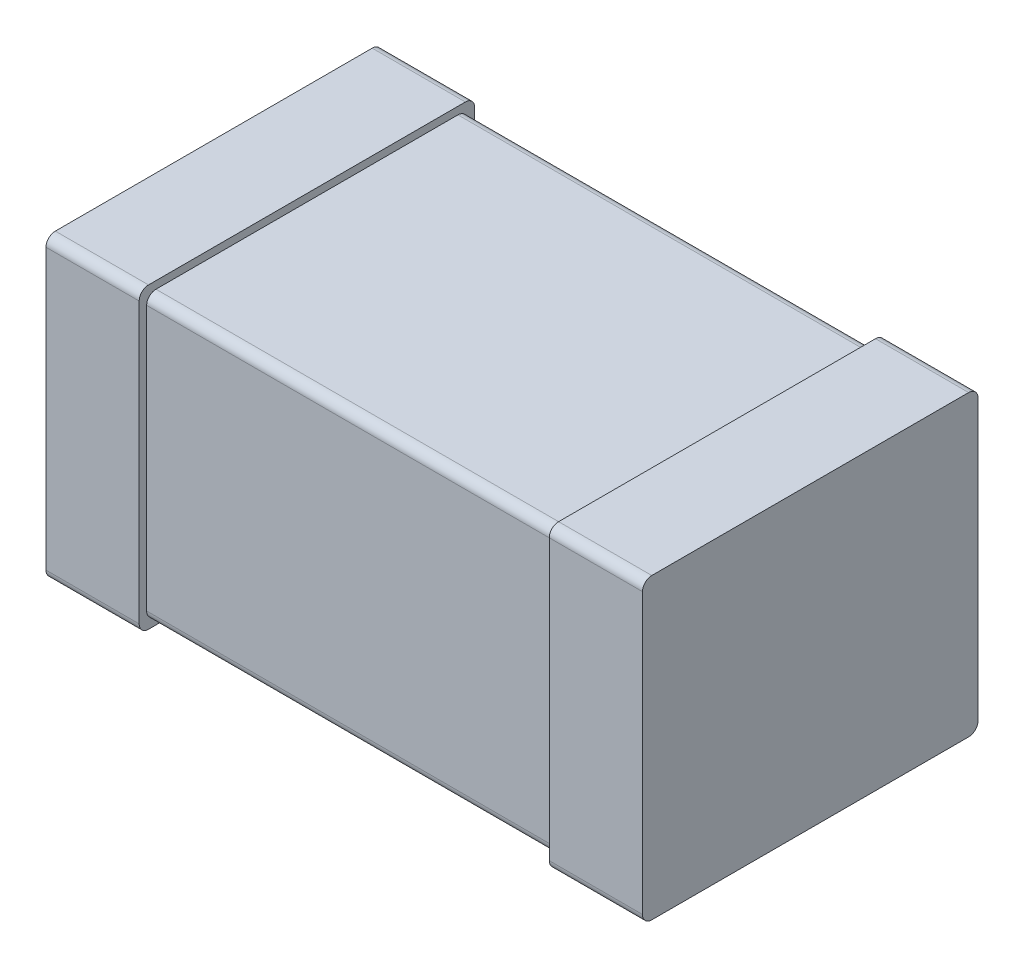
ISO-10303-21;
HEADER;
FILE_DESCRIPTION(('STEP AP214'),'2;1');
FILE_NAME('part.step','',(''),(''),'','','');
FILE_SCHEMA(('AUTOMOTIVE_DESIGN { 1 0 10303 214 1 1 1 1 }'));
ENDSEC;
DATA;
#1=APPLICATION_CONTEXT('core data for automotive mechanical design processes');
#2=APPLICATION_PROTOCOL_DEFINITION('international standard','automotive_design',2000,#1);
#3=PRODUCT_CONTEXT('',#1,'mechanical');
#4=PRODUCT('Part','Part','',(#3));
#5=PRODUCT_RELATED_PRODUCT_CATEGORY('part','',(#4));
#6=PRODUCT_DEFINITION_FORMATION('','',#4);
#7=PRODUCT_DEFINITION_CONTEXT('part definition',#1,'design');
#8=PRODUCT_DEFINITION('design','',#6,#7);
#9=PRODUCT_DEFINITION_SHAPE('','',#8);
#10=(LENGTH_UNIT() NAMED_UNIT(*) SI_UNIT(.MILLI.,.METRE.));
#11=(NAMED_UNIT(*) PLANE_ANGLE_UNIT() SI_UNIT($,.RADIAN.));
#12=(NAMED_UNIT(*) SI_UNIT($,.STERADIAN.) SOLID_ANGLE_UNIT());
#13=UNCERTAINTY_MEASURE_WITH_UNIT(LENGTH_MEASURE(1.E-05),#10,'distance_accuracy_value','');
#14=(GEOMETRIC_REPRESENTATION_CONTEXT(3) GLOBAL_UNCERTAINTY_ASSIGNED_CONTEXT((#13)) GLOBAL_UNIT_ASSIGNED_CONTEXT((#10,
#11,#12)) REPRESENTATION_CONTEXT('',''));
#15=CARTESIAN_POINT('',(0.,0.,0.));
#16=DIRECTION('',(0.,0.,1.));
#17=DIRECTION('',(1.,0.,0.));
#18=AXIS2_PLACEMENT_3D('',#15,#16,#17);
#19=CARTESIAN_POINT('',(0.8,-0.4,0.));
#20=DIRECTION('',(1.,0.,0.));
#21=DIRECTION('',(0.,0.,-1.));
#22=AXIS2_PLACEMENT_3D('',#19,#20,#21);
#23=PLANE('',#22);
#24=DIRECTION('',(0.,1.,0.));
#25=VECTOR('',#24,1.);
#26=CARTESIAN_POINT('',(0.8,-0.4,0.9));
#27=LINE('',#26,#25);
#28=CARTESIAN_POINT('',(0.8,-0.375,0.9));
#29=VERTEX_POINT('',#28);
#30=CARTESIAN_POINT('',(0.8,0.375,0.9));
#31=VERTEX_POINT('',#30);
#32=EDGE_CURVE('E294',#29,#31,#27,.T.);
#33=ORIENTED_EDGE('',*,*,#32,.F.);
#34=CARTESIAN_POINT('',(0.8,-0.375,0.875));
#35=DIRECTION('',(1.,0.,0.));
#36=DIRECTION('',(0.,0.,-1.));
#37=AXIS2_PLACEMENT_3D('',#34,#35,#36);
#38=CIRCLE('',#37,0.025);
#39=CARTESIAN_POINT('',(0.8,-0.4,0.875));
#40=VERTEX_POINT('',#39);
#41=EDGE_CURVE('E178',#40,#29,#38,.F.);
#42=ORIENTED_EDGE('',*,*,#41,.F.);
#43=DIRECTION('',(0.,0.,1.));
#44=VECTOR('',#43,1.);
#45=CARTESIAN_POINT('',(0.8,-0.4,0.));
#46=LINE('',#45,#44);
#47=CARTESIAN_POINT('',(0.8,-0.4,0.025));
#48=VERTEX_POINT('',#47);
#49=EDGE_CURVE('E175',#40,#48,#46,.F.);
#50=ORIENTED_EDGE('',*,*,#49,.T.);
#51=CARTESIAN_POINT('',(0.8,-0.375,0.025));
#52=DIRECTION('',(1.,0.,0.));
#53=DIRECTION('',(0.,0.,-1.));
#54=AXIS2_PLACEMENT_3D('',#51,#52,#53);
#55=CIRCLE('',#54,0.025);
#56=CARTESIAN_POINT('',(0.8,-0.375,0.));
#57=VERTEX_POINT('',#56);
#58=EDGE_CURVE('E20',#57,#48,#55,.F.);
#59=ORIENTED_EDGE('',*,*,#58,.F.);
#60=DIRECTION('',(0.,1.,0.));
#61=VECTOR('',#60,1.);
#62=CARTESIAN_POINT('',(0.8,-0.4,0.));
#63=LINE('',#62,#61);
#64=CARTESIAN_POINT('',(0.8,0.375,0.));
#65=VERTEX_POINT('',#64);
#66=EDGE_CURVE('E197',#57,#65,#63,.T.);
#67=ORIENTED_EDGE('',*,*,#66,.T.);
#68=CARTESIAN_POINT('',(0.8,0.375,0.025));
#69=DIRECTION('',(1.,0.,0.));
#70=DIRECTION('',(0.,0.,-1.));
#71=AXIS2_PLACEMENT_3D('',#68,#69,#70);
#72=CIRCLE('',#71,0.025);
#73=CARTESIAN_POINT('',(0.8,0.4,0.025));
#74=VERTEX_POINT('',#73);
#75=EDGE_CURVE('E204',#74,#65,#72,.F.);
#76=ORIENTED_EDGE('',*,*,#75,.F.);
#77=DIRECTION('',(0.,0.,1.));
#78=VECTOR('',#77,1.);
#79=CARTESIAN_POINT('',(0.8,0.4,0.));
#80=LINE('',#79,#78);
#81=CARTESIAN_POINT('',(0.8,0.4,0.875));
#82=VERTEX_POINT('',#81);
#83=EDGE_CURVE('E208',#82,#74,#80,.F.);
#84=ORIENTED_EDGE('',*,*,#83,.F.);
#85=CARTESIAN_POINT('',(0.8,0.375,0.875));
#86=DIRECTION('',(1.,0.,0.));
#87=DIRECTION('',(0.,0.,-1.));
#88=AXIS2_PLACEMENT_3D('',#85,#86,#87);
#89=CIRCLE('',#88,0.025);
#90=EDGE_CURVE('E287',#31,#82,#89,.F.);
#91=ORIENTED_EDGE('',*,*,#90,.F.);
#92=EDGE_LOOP('',(#33,#42,#50,#59,#67,#76,#84,#91));
#93=FACE_BOUND('',#92,.T.);
#94=ADVANCED_FACE('F17',(#93),#23,.T.);
#95=CARTESIAN_POINT('',(-0.8,-0.4,0.));
#96=DIRECTION('',(1.,0.,0.));
#97=DIRECTION('',(0.,0.,-1.));
#98=AXIS2_PLACEMENT_3D('',#95,#96,#97);
#99=PLANE('',#98);
#100=DIRECTION('',(0.,1.,0.));
#101=VECTOR('',#100,1.);
#102=CARTESIAN_POINT('',(-0.8,-0.4,0.9));
#103=LINE('',#102,#101);
#104=CARTESIAN_POINT('',(-0.8,0.375,0.9));
#105=VERTEX_POINT('',#104);
#106=CARTESIAN_POINT('',(-0.8,-0.375,0.9));
#107=VERTEX_POINT('',#106);
#108=EDGE_CURVE('E305',#105,#107,#103,.F.);
#109=ORIENTED_EDGE('',*,*,#108,.F.);
#110=CARTESIAN_POINT('',(-0.8,0.375,0.875));
#111=DIRECTION('',(1.,0.,0.));
#112=DIRECTION('',(0.,0.,-1.));
#113=AXIS2_PLACEMENT_3D('',#110,#111,#112);
#114=CIRCLE('',#113,0.025);
#115=CARTESIAN_POINT('',(-0.8,0.4,0.875));
#116=VERTEX_POINT('',#115);
#117=EDGE_CURVE('E270',#116,#105,#114,.T.);
#118=ORIENTED_EDGE('',*,*,#117,.F.);
#119=DIRECTION('',(0.,0.,1.));
#120=VECTOR('',#119,1.);
#121=CARTESIAN_POINT('',(-0.8,0.4,0.));
#122=LINE('',#121,#120);
#123=CARTESIAN_POINT('',(-0.8,0.4,0.025));
#124=VERTEX_POINT('',#123);
#125=EDGE_CURVE('E274',#124,#116,#122,.T.);
#126=ORIENTED_EDGE('',*,*,#125,.F.);
#127=CARTESIAN_POINT('',(-0.8,0.375,0.025));
#128=DIRECTION('',(1.,0.,0.));
#129=DIRECTION('',(0.,0.,-1.));
#130=AXIS2_PLACEMENT_3D('',#127,#128,#129);
#131=CIRCLE('',#130,0.025);
#132=CARTESIAN_POINT('',(-0.8,0.375,0.));
#133=VERTEX_POINT('',#132);
#134=EDGE_CURVE('E275',#133,#124,#131,.T.);
#135=ORIENTED_EDGE('',*,*,#134,.F.);
#136=DIRECTION('',(0.,1.,0.));
#137=VECTOR('',#136,1.);
#138=CARTESIAN_POINT('',(-0.8,-0.4,0.));
#139=LINE('',#138,#137);
#140=CARTESIAN_POINT('',(-0.8,-0.375,0.));
#141=VERTEX_POINT('',#140);
#142=EDGE_CURVE('E311',#133,#141,#139,.F.);
#143=ORIENTED_EDGE('',*,*,#142,.T.);
#144=CARTESIAN_POINT('',(-0.8,-0.375,0.025));
#145=DIRECTION('',(1.,0.,0.));
#146=DIRECTION('',(0.,0.,-1.));
#147=AXIS2_PLACEMENT_3D('',#144,#145,#146);
#148=CIRCLE('',#147,0.025);
#149=CARTESIAN_POINT('',(-0.8,-0.4,0.025));
#150=VERTEX_POINT('',#149);
#151=EDGE_CURVE('E279',#150,#141,#148,.T.);
#152=ORIENTED_EDGE('',*,*,#151,.F.);
#153=DIRECTION('',(0.,0.,1.));
#154=VECTOR('',#153,1.);
#155=CARTESIAN_POINT('',(-0.8,-0.4,0.));
#156=LINE('',#155,#154);
#157=CARTESIAN_POINT('',(-0.8,-0.4,0.875));
#158=VERTEX_POINT('',#157);
#159=EDGE_CURVE('E283',#150,#158,#156,.T.);
#160=ORIENTED_EDGE('',*,*,#159,.T.);
#161=CARTESIAN_POINT('',(-0.8,-0.375,0.875));
#162=DIRECTION('',(1.,0.,0.));
#163=DIRECTION('',(0.,0.,-1.));
#164=AXIS2_PLACEMENT_3D('',#161,#162,#163);
#165=CIRCLE('',#164,0.025);
#166=EDGE_CURVE('E265',#107,#158,#165,.T.);
#167=ORIENTED_EDGE('',*,*,#166,.F.);
#168=EDGE_LOOP('',(#109,#118,#126,#135,#143,#152,#160,#167));
#169=FACE_BOUND('',#168,.T.);
#170=ADVANCED_FACE('F699',(#169),#99,.F.);
#171=CARTESIAN_POINT('',(0.55,-0.4,0.));
#172=DIRECTION('',(0.,1.,0.));
#173=DIRECTION('',(0.,0.,1.));
#174=AXIS2_PLACEMENT_3D('',#171,#172,#173);
#175=PLANE('',#174);
#176=DIRECTION('',(0.,0.,-1.));
#177=VECTOR('',#176,1.);
#178=CARTESIAN_POINT('',(0.55,-0.4,0.));
#179=LINE('',#178,#177);
#180=CARTESIAN_POINT('',(0.55,-0.4,0.875));
#181=VERTEX_POINT('',#180);
#182=CARTESIAN_POINT('',(0.55,-0.4,0.025));
#183=VERTEX_POINT('',#182);
#184=EDGE_CURVE('E186',#181,#183,#179,.T.);
#185=ORIENTED_EDGE('',*,*,#184,.T.);
#186=DIRECTION('',(1.,0.,0.));
#187=VECTOR('',#186,1.);
#188=CARTESIAN_POINT('',(0.55,-0.4,0.025));
#189=LINE('',#188,#187);
#190=EDGE_CURVE('E183',#48,#183,#189,.F.);
#191=ORIENTED_EDGE('',*,*,#190,.F.);
#192=ORIENTED_EDGE('',*,*,#49,.F.);
#193=DIRECTION('',(1.,0.,0.));
#194=VECTOR('',#193,1.);
#195=CARTESIAN_POINT('',(0.55,-0.4,0.875));
#196=LINE('',#195,#194);
#197=EDGE_CURVE('E286',#181,#40,#196,.T.);
#198=ORIENTED_EDGE('',*,*,#197,.F.);
#199=EDGE_LOOP('',(#185,#191,#192,#198));
#200=FACE_BOUND('',#199,.T.);
#201=ADVANCED_FACE('F184',(#200),#175,.F.);
#202=CARTESIAN_POINT('',(0.55,-0.375,0.025));
#203=DIRECTION('',(1.,0.,0.));
#204=DIRECTION('',(0.,0.,-1.));
#205=AXIS2_PLACEMENT_3D('',#202,#203,#204);
#206=CYLINDRICAL_SURFACE('',#205,0.025);
#207=ORIENTED_EDGE('',*,*,#58,.T.);
#208=ORIENTED_EDGE('',*,*,#190,.T.);
#209=CARTESIAN_POINT('',(0.55,-0.375,0.025));
#210=DIRECTION('',(1.,0.,0.));
#211=DIRECTION('',(0.,0.,-1.));
#212=AXIS2_PLACEMENT_3D('',#209,#210,#211);
#213=CIRCLE('',#212,0.025);
#214=CARTESIAN_POINT('',(0.55,-0.375,0.));
#215=VERTEX_POINT('',#214);
#216=EDGE_CURVE('E194',#183,#215,#213,.T.);
#217=ORIENTED_EDGE('',*,*,#216,.T.);
#218=DIRECTION('',(1.,0.,0.));
#219=VECTOR('',#218,1.);
#220=CARTESIAN_POINT('',(0.55,-0.375,0.));
#221=LINE('',#220,#219);
#222=EDGE_CURVE('E189',#215,#57,#221,.T.);
#223=ORIENTED_EDGE('',*,*,#222,.T.);
#224=EDGE_LOOP('',(#207,#208,#217,#223));
#225=FACE_BOUND('',#224,.T.);
#226=ADVANCED_FACE('F191',(#225),#206,.T.);
#227=CARTESIAN_POINT('',(0.55,-0.4,0.));
#228=DIRECTION('',(0.,0.,1.));
#229=DIRECTION('',(1.,0.,0.));
#230=AXIS2_PLACEMENT_3D('',#227,#228,#229);
#231=PLANE('',#230);
#232=ORIENTED_EDGE('',*,*,#66,.F.);
#233=ORIENTED_EDGE('',*,*,#222,.F.);
#234=DIRECTION('',(0.,1.,0.));
#235=VECTOR('',#234,1.);
#236=CARTESIAN_POINT('',(0.55,-0.4,0.));
#237=LINE('',#236,#235);
#238=CARTESIAN_POINT('',(0.55,0.375,0.));
#239=VERTEX_POINT('',#238);
#240=EDGE_CURVE('E263',#215,#239,#237,.T.);
#241=ORIENTED_EDGE('',*,*,#240,.T.);
#242=DIRECTION('',(1.,0.,0.));
#243=VECTOR('',#242,1.);
#244=CARTESIAN_POINT('',(0.55,0.375,0.));
#245=LINE('',#244,#243);
#246=EDGE_CURVE('E202',#65,#239,#245,.F.);
#247=ORIENTED_EDGE('',*,*,#246,.F.);
#248=EDGE_LOOP('',(#232,#233,#241,#247));
#249=FACE_BOUND('',#248,.T.);
#250=ADVANCED_FACE('F200',(#249),#231,.F.);
#251=CARTESIAN_POINT('',(0.55,0.375,0.025));
#252=DIRECTION('',(1.,0.,0.));
#253=DIRECTION('',(0.,0.,-1.));
#254=AXIS2_PLACEMENT_3D('',#251,#252,#253);
#255=CYLINDRICAL_SURFACE('',#254,0.025);
#256=ORIENTED_EDGE('',*,*,#246,.T.);
#257=CARTESIAN_POINT('',(0.55,0.375,0.025));
#258=DIRECTION('',(1.,0.,0.));
#259=DIRECTION('',(0.,0.,-1.));
#260=AXIS2_PLACEMENT_3D('',#257,#258,#259);
#261=CIRCLE('',#260,0.025);
#262=CARTESIAN_POINT('',(0.55,0.4,0.025));
#263=VERTEX_POINT('',#262);
#264=EDGE_CURVE('E261',#239,#263,#261,.T.);
#265=ORIENTED_EDGE('',*,*,#264,.T.);
#266=DIRECTION('',(1.,0.,0.));
#267=VECTOR('',#266,1.);
#268=CARTESIAN_POINT('',(0.55,0.4,0.025));
#269=LINE('',#268,#267);
#270=EDGE_CURVE('E290',#74,#263,#269,.F.);
#271=ORIENTED_EDGE('',*,*,#270,.F.);
#272=ORIENTED_EDGE('',*,*,#75,.T.);
#273=EDGE_LOOP('',(#256,#265,#271,#272));
#274=FACE_BOUND('',#273,.T.);
#275=ADVANCED_FACE('F425',(#274),#255,.T.);
#276=CARTESIAN_POINT('',(0.55,0.4,0.));
#277=DIRECTION('',(0.,1.,0.));
#278=DIRECTION('',(0.,0.,1.));
#279=AXIS2_PLACEMENT_3D('',#276,#277,#278);
#280=PLANE('',#279);
#281=DIRECTION('',(0.,0.,-1.));
#282=VECTOR('',#281,1.);
#283=CARTESIAN_POINT('',(0.55,0.4,0.));
#284=LINE('',#283,#282);
#285=CARTESIAN_POINT('',(0.55,0.4,0.875));
#286=VERTEX_POINT('',#285);
#287=EDGE_CURVE('E260',#263,#286,#284,.F.);
#288=ORIENTED_EDGE('',*,*,#287,.T.);
#289=DIRECTION('',(1.,0.,0.));
#290=VECTOR('',#289,1.);
#291=CARTESIAN_POINT('',(0.55,0.4,0.875));
#292=LINE('',#291,#290);
#293=EDGE_CURVE('E289',#82,#286,#292,.F.);
#294=ORIENTED_EDGE('',*,*,#293,.F.);
#295=ORIENTED_EDGE('',*,*,#83,.T.);
#296=ORIENTED_EDGE('',*,*,#270,.T.);
#297=EDGE_LOOP('',(#288,#294,#295,#296));
#298=FACE_BOUND('',#297,.T.);
#299=ADVANCED_FACE('F427',(#298),#280,.T.);
#300=CARTESIAN_POINT('',(0.55,0.375,0.875));
#301=DIRECTION('',(1.,0.,0.));
#302=DIRECTION('',(0.,0.,-1.));
#303=AXIS2_PLACEMENT_3D('',#300,#301,#302);
#304=CYLINDRICAL_SURFACE('',#303,0.025);
#305=ORIENTED_EDGE('',*,*,#90,.T.);
#306=ORIENTED_EDGE('',*,*,#293,.T.);
#307=CARTESIAN_POINT('',(0.55,0.375,0.875));
#308=DIRECTION('',(1.,0.,0.));
#309=DIRECTION('',(0.,0.,-1.));
#310=AXIS2_PLACEMENT_3D('',#307,#308,#309);
#311=CIRCLE('',#310,0.025);
#312=CARTESIAN_POINT('',(0.55,0.375,0.9));
#313=VERTEX_POINT('',#312);
#314=EDGE_CURVE('E258',#286,#313,#311,.T.);
#315=ORIENTED_EDGE('',*,*,#314,.T.);
#316=DIRECTION('',(1.,0.,0.));
#317=VECTOR('',#316,1.);
#318=CARTESIAN_POINT('',(0.55,0.375,0.9));
#319=LINE('',#318,#317);
#320=EDGE_CURVE('E315',#31,#313,#319,.F.);
#321=ORIENTED_EDGE('',*,*,#320,.F.);
#322=EDGE_LOOP('',(#305,#306,#315,#321));
#323=FACE_BOUND('',#322,.T.);
#324=ADVANCED_FACE('F428',(#323),#304,.T.);
#325=CARTESIAN_POINT('',(0.55,-0.4,0.9));
#326=DIRECTION('',(0.,0.,1.));
#327=DIRECTION('',(1.,0.,0.));
#328=AXIS2_PLACEMENT_3D('',#325,#326,#327);
#329=PLANE('',#328);
#330=ORIENTED_EDGE('',*,*,#32,.T.);
#331=ORIENTED_EDGE('',*,*,#320,.T.);
#332=DIRECTION('',(0.,1.,0.));
#333=VECTOR('',#332,1.);
#334=CARTESIAN_POINT('',(0.55,-0.4,0.9));
#335=LINE('',#334,#333);
#336=CARTESIAN_POINT('',(0.55,-0.375,0.9));
#337=VERTEX_POINT('',#336);
#338=EDGE_CURVE('E257',#313,#337,#335,.F.);
#339=ORIENTED_EDGE('',*,*,#338,.T.);
#340=DIRECTION('',(1.,0.,0.));
#341=VECTOR('',#340,1.);
#342=CARTESIAN_POINT('',(0.55,-0.375,0.9));
#343=LINE('',#342,#341);
#344=EDGE_CURVE('E285',#29,#337,#343,.F.);
#345=ORIENTED_EDGE('',*,*,#344,.F.);
#346=EDGE_LOOP('',(#330,#331,#339,#345));
#347=FACE_BOUND('',#346,.T.);
#348=ADVANCED_FACE('F420',(#347),#329,.T.);
#349=CARTESIAN_POINT('',(0.55,-0.375,0.875));
#350=DIRECTION('',(1.,0.,0.));
#351=DIRECTION('',(0.,0.,-1.));
#352=AXIS2_PLACEMENT_3D('',#349,#350,#351);
#353=CYLINDRICAL_SURFACE('',#352,0.025);
#354=ORIENTED_EDGE('',*,*,#344,.T.);
#355=CARTESIAN_POINT('',(0.55,-0.375,0.875));
#356=DIRECTION('',(1.,0.,0.));
#357=DIRECTION('',(0.,0.,-1.));
#358=AXIS2_PLACEMENT_3D('',#355,#356,#357);
#359=CIRCLE('',#358,0.025);
#360=EDGE_CURVE('E254',#337,#181,#359,.T.);
#361=ORIENTED_EDGE('',*,*,#360,.T.);
#362=ORIENTED_EDGE('',*,*,#197,.T.);
#363=ORIENTED_EDGE('',*,*,#41,.T.);
#364=EDGE_LOOP('',(#354,#361,#362,#363));
#365=FACE_BOUND('',#364,.T.);
#366=ADVANCED_FACE('F422',(#365),#353,.T.);
#367=CARTESIAN_POINT('',(-0.8,-0.4,0.));
#368=DIRECTION('',(0.,1.,0.));
#369=DIRECTION('',(0.,0.,1.));
#370=AXIS2_PLACEMENT_3D('',#367,#368,#369);
#371=PLANE('',#370);
#372=ORIENTED_EDGE('',*,*,#159,.F.);
#373=DIRECTION('',(1.,0.,0.));
#374=VECTOR('',#373,1.);
#375=CARTESIAN_POINT('',(-0.8,-0.4,0.025));
#376=LINE('',#375,#374);
#377=CARTESIAN_POINT('',(-0.55,-0.4,0.025));
#378=VERTEX_POINT('',#377);
#379=EDGE_CURVE('E282',#378,#150,#376,.F.);
#380=ORIENTED_EDGE('',*,*,#379,.F.);
#381=DIRECTION('',(0.,0.,-1.));
#382=VECTOR('',#381,1.);
#383=CARTESIAN_POINT('',(-0.55,-0.4,0.));
#384=LINE('',#383,#382);
#385=CARTESIAN_POINT('',(-0.55,-0.4,0.875));
#386=VERTEX_POINT('',#385);
#387=EDGE_CURVE('E242',#386,#378,#384,.T.);
#388=ORIENTED_EDGE('',*,*,#387,.F.);
#389=DIRECTION('',(1.,0.,0.));
#390=VECTOR('',#389,1.);
#391=CARTESIAN_POINT('',(-0.8,-0.4,0.875));
#392=LINE('',#391,#390);
#393=EDGE_CURVE('E335',#158,#386,#392,.T.);
#394=ORIENTED_EDGE('',*,*,#393,.F.);
#395=EDGE_LOOP('',(#372,#380,#388,#394));
#396=FACE_BOUND('',#395,.T.);
#397=ADVANCED_FACE('F486',(#396),#371,.F.);
#398=CARTESIAN_POINT('',(-0.8,-0.375,0.025));
#399=DIRECTION('',(1.,0.,0.));
#400=DIRECTION('',(0.,0.,-1.));
#401=AXIS2_PLACEMENT_3D('',#398,#399,#400);
#402=CYLINDRICAL_SURFACE('',#401,0.025);
#403=CARTESIAN_POINT('',(-0.55,-0.375,0.025));
#404=DIRECTION('',(1.,0.,0.));
#405=DIRECTION('',(0.,0.,-1.));
#406=AXIS2_PLACEMENT_3D('',#403,#404,#405);
#407=CIRCLE('',#406,0.025);
#408=CARTESIAN_POINT('',(-0.55,-0.375,0.));
#409=VERTEX_POINT('',#408);
#410=EDGE_CURVE('E239',#378,#409,#407,.T.);
#411=ORIENTED_EDGE('',*,*,#410,.F.);
#412=ORIENTED_EDGE('',*,*,#379,.T.);
#413=ORIENTED_EDGE('',*,*,#151,.T.);
#414=DIRECTION('',(1.,0.,0.));
#415=VECTOR('',#414,1.);
#416=CARTESIAN_POINT('',(-0.8,-0.375,0.));
#417=LINE('',#416,#415);
#418=EDGE_CURVE('E313',#141,#409,#417,.T.);
#419=ORIENTED_EDGE('',*,*,#418,.T.);
#420=EDGE_LOOP('',(#411,#412,#413,#419));
#421=FACE_BOUND('',#420,.T.);
#422=ADVANCED_FACE('F482',(#421),#402,.T.);
#423=CARTESIAN_POINT('',(-0.8,-0.4,0.));
#424=DIRECTION('',(0.,0.,1.));
#425=DIRECTION('',(1.,0.,0.));
#426=AXIS2_PLACEMENT_3D('',#423,#424,#425);
#427=PLANE('',#426);
#428=DIRECTION('',(0.,1.,0.));
#429=VECTOR('',#428,1.);
#430=CARTESIAN_POINT('',(-0.55,-0.4,0.));
#431=LINE('',#430,#429);
#432=CARTESIAN_POINT('',(-0.55,0.375,0.));
#433=VERTEX_POINT('',#432);
#434=EDGE_CURVE('E238',#409,#433,#431,.T.);
#435=ORIENTED_EDGE('',*,*,#434,.F.);
#436=ORIENTED_EDGE('',*,*,#418,.F.);
#437=ORIENTED_EDGE('',*,*,#142,.F.);
#438=DIRECTION('',(1.,0.,0.));
#439=VECTOR('',#438,1.);
#440=CARTESIAN_POINT('',(-0.8,0.375,0.));
#441=LINE('',#440,#439);
#442=EDGE_CURVE('E278',#433,#133,#441,.F.);
#443=ORIENTED_EDGE('',*,*,#442,.F.);
#444=EDGE_LOOP('',(#435,#436,#437,#443));
#445=FACE_BOUND('',#444,.T.);
#446=ADVANCED_FACE('F478',(#445),#427,.F.);
#447=CARTESIAN_POINT('',(-0.8,0.375,0.025));
#448=DIRECTION('',(1.,0.,0.));
#449=DIRECTION('',(0.,0.,-1.));
#450=AXIS2_PLACEMENT_3D('',#447,#448,#449);
#451=CYLINDRICAL_SURFACE('',#450,0.025);
#452=ORIENTED_EDGE('',*,*,#442,.T.);
#453=ORIENTED_EDGE('',*,*,#134,.T.);
#454=DIRECTION('',(1.,0.,0.));
#455=VECTOR('',#454,1.);
#456=CARTESIAN_POINT('',(-0.8,0.4,0.025));
#457=LINE('',#456,#455);
#458=CARTESIAN_POINT('',(-0.55,0.4,0.025));
#459=VERTEX_POINT('',#458);
#460=EDGE_CURVE('E277',#459,#124,#457,.F.);
#461=ORIENTED_EDGE('',*,*,#460,.F.);
#462=CARTESIAN_POINT('',(-0.55,0.375,0.025));
#463=DIRECTION('',(1.,0.,0.));
#464=DIRECTION('',(0.,0.,-1.));
#465=AXIS2_PLACEMENT_3D('',#462,#463,#464);
#466=CIRCLE('',#465,0.025);
#467=EDGE_CURVE('E235',#433,#459,#466,.T.);
#468=ORIENTED_EDGE('',*,*,#467,.F.);
#469=EDGE_LOOP('',(#452,#453,#461,#468));
#470=FACE_BOUND('',#469,.T.);
#471=ADVANCED_FACE('F474',(#470),#451,.T.);
#472=CARTESIAN_POINT('',(-0.8,0.4,0.));
#473=DIRECTION('',(0.,1.,0.));
#474=DIRECTION('',(0.,0.,1.));
#475=AXIS2_PLACEMENT_3D('',#472,#473,#474);
#476=PLANE('',#475);
#477=ORIENTED_EDGE('',*,*,#125,.T.);
#478=DIRECTION('',(1.,0.,0.));
#479=VECTOR('',#478,1.);
#480=CARTESIAN_POINT('',(-0.8,0.4,0.875));
#481=LINE('',#480,#479);
#482=CARTESIAN_POINT('',(-0.55,0.4,0.875));
#483=VERTEX_POINT('',#482);
#484=EDGE_CURVE('E273',#483,#116,#481,.F.);
#485=ORIENTED_EDGE('',*,*,#484,.F.);
#486=DIRECTION('',(0.,0.,-1.));
#487=VECTOR('',#486,1.);
#488=CARTESIAN_POINT('',(-0.55,0.4,0.));
#489=LINE('',#488,#487);
#490=EDGE_CURVE('E234',#459,#483,#489,.F.);
#491=ORIENTED_EDGE('',*,*,#490,.F.);
#492=ORIENTED_EDGE('',*,*,#460,.T.);
#493=EDGE_LOOP('',(#477,#485,#491,#492));
#494=FACE_BOUND('',#493,.T.);
#495=ADVANCED_FACE('F470',(#494),#476,.T.);
#496=CARTESIAN_POINT('',(-0.8,0.375,0.875));
#497=DIRECTION('',(1.,0.,0.));
#498=DIRECTION('',(0.,0.,-1.));
#499=AXIS2_PLACEMENT_3D('',#496,#497,#498);
#500=CYLINDRICAL_SURFACE('',#499,0.025);
#501=CARTESIAN_POINT('',(-0.55,0.375,0.875));
#502=DIRECTION('',(1.,0.,0.));
#503=DIRECTION('',(0.,0.,-1.));
#504=AXIS2_PLACEMENT_3D('',#501,#502,#503);
#505=CIRCLE('',#504,0.025);
#506=CARTESIAN_POINT('',(-0.55,0.375,0.9));
#507=VERTEX_POINT('',#506);
#508=EDGE_CURVE('E231',#483,#507,#505,.T.);
#509=ORIENTED_EDGE('',*,*,#508,.F.);
#510=ORIENTED_EDGE('',*,*,#484,.T.);
#511=ORIENTED_EDGE('',*,*,#117,.T.);
#512=DIRECTION('',(1.,0.,0.));
#513=VECTOR('',#512,1.);
#514=CARTESIAN_POINT('',(-0.8,0.375,0.9));
#515=LINE('',#514,#513);
#516=EDGE_CURVE('E307',#507,#105,#515,.F.);
#517=ORIENTED_EDGE('',*,*,#516,.F.);
#518=EDGE_LOOP('',(#509,#510,#511,#517));
#519=FACE_BOUND('',#518,.T.);
#520=ADVANCED_FACE('F466',(#519),#500,.T.);
#521=CARTESIAN_POINT('',(-0.8,-0.4,0.9));
#522=DIRECTION('',(0.,0.,1.));
#523=DIRECTION('',(1.,0.,0.));
#524=AXIS2_PLACEMENT_3D('',#521,#522,#523);
#525=PLANE('',#524);
#526=DIRECTION('',(0.,1.,0.));
#527=VECTOR('',#526,1.);
#528=CARTESIAN_POINT('',(-0.55,-0.4,0.9));
#529=LINE('',#528,#527);
#530=CARTESIAN_POINT('',(-0.55,-0.375,0.9));
#531=VERTEX_POINT('',#530);
#532=EDGE_CURVE('E230',#507,#531,#529,.F.);
#533=ORIENTED_EDGE('',*,*,#532,.F.);
#534=ORIENTED_EDGE('',*,*,#516,.T.);
#535=ORIENTED_EDGE('',*,*,#108,.T.);
#536=DIRECTION('',(1.,0.,0.));
#537=VECTOR('',#536,1.);
#538=CARTESIAN_POINT('',(-0.8,-0.375,0.9));
#539=LINE('',#538,#537);
#540=EDGE_CURVE('E269',#531,#107,#539,.F.);
#541=ORIENTED_EDGE('',*,*,#540,.F.);
#542=EDGE_LOOP('',(#533,#534,#535,#541));
#543=FACE_BOUND('',#542,.T.);
#544=ADVANCED_FACE('F462',(#543),#525,.T.);
#545=CARTESIAN_POINT('',(-0.8,-0.375,0.875));
#546=DIRECTION('',(1.,0.,0.));
#547=DIRECTION('',(0.,0.,-1.));
#548=AXIS2_PLACEMENT_3D('',#545,#546,#547);
#549=CYLINDRICAL_SURFACE('',#548,0.025);
#550=ORIENTED_EDGE('',*,*,#540,.T.);
#551=ORIENTED_EDGE('',*,*,#166,.T.);
#552=ORIENTED_EDGE('',*,*,#393,.T.);
#553=CARTESIAN_POINT('',(-0.55,-0.375,0.875));
#554=DIRECTION('',(1.,0.,0.));
#555=DIRECTION('',(0.,0.,-1.));
#556=AXIS2_PLACEMENT_3D('',#553,#554,#555);
#557=CIRCLE('',#556,0.025);
#558=EDGE_CURVE('E227',#531,#386,#557,.T.);
#559=ORIENTED_EDGE('',*,*,#558,.F.);
#560=EDGE_LOOP('',(#550,#551,#552,#559));
#561=FACE_BOUND('',#560,.T.);
#562=ADVANCED_FACE('F459',(#561),#549,.T.);
#563=CARTESIAN_POINT('',(-0.55,-0.355,0.045));
#564=DIRECTION('',(1.,0.,0.));
#565=DIRECTION('',(0.,0.,-1.));
#566=AXIS2_PLACEMENT_3D('',#563,#564,#565);
#567=CYLINDRICAL_SURFACE('',#566,0.025);
#568=CARTESIAN_POINT('',(0.55,-0.355,0.045));
#569=DIRECTION('',(1.,0.,0.));
#570=DIRECTION('',(0.,0.,-1.));
#571=AXIS2_PLACEMENT_3D('',#568,#569,#570);
#572=CIRCLE('',#571,0.025);
#573=CARTESIAN_POINT('',(0.55,-0.355,0.02));
#574=VERTEX_POINT('',#573);
#575=CARTESIAN_POINT('',(0.55,-0.38,0.045));
#576=VERTEX_POINT('',#575);
#577=EDGE_CURVE('E252',#574,#576,#572,.F.);
#578=ORIENTED_EDGE('',*,*,#577,.T.);
#579=DIRECTION('',(1.,0.,0.));
#580=VECTOR('',#579,1.);
#581=CARTESIAN_POINT('',(-0.55,-0.38,0.045));
#582=LINE('',#581,#580);
#583=CARTESIAN_POINT('',(-0.55,-0.38,0.045));
#584=VERTEX_POINT('',#583);
#585=EDGE_CURVE('E268',#576,#584,#582,.F.);
#586=ORIENTED_EDGE('',*,*,#585,.T.);
#587=CARTESIAN_POINT('',(-0.55,-0.355,0.045));
#588=DIRECTION('',(1.,0.,0.));
#589=DIRECTION('',(0.,0.,-1.));
#590=AXIS2_PLACEMENT_3D('',#587,#588,#589);
#591=CIRCLE('',#590,0.025);
#592=CARTESIAN_POINT('',(-0.55,-0.355,0.02));
#593=VERTEX_POINT('',#592);
#594=EDGE_CURVE('E224',#593,#584,#591,.F.);
#595=ORIENTED_EDGE('',*,*,#594,.F.);
#596=DIRECTION('',(1.,0.,0.));
#597=VECTOR('',#596,1.);
#598=CARTESIAN_POINT('',(-0.55,-0.355,0.02));
#599=LINE('',#598,#597);
#600=EDGE_CURVE('E344',#593,#574,#599,.T.);
#601=ORIENTED_EDGE('',*,*,#600,.T.);
#602=EDGE_LOOP('',(#578,#586,#595,#601));
#603=FACE_BOUND('',#602,.T.);
#604=ADVANCED_FACE('F389',(#603),#567,.T.);
#605=CARTESIAN_POINT('',(-0.55,-0.38,0.02));
#606=DIRECTION('',(0.,1.,0.));
#607=DIRECTION('',(0.,0.,1.));
#608=AXIS2_PLACEMENT_3D('',#605,#606,#607);
#609=PLANE('',#608);
#610=DIRECTION('',(0.,0.,-1.));
#611=VECTOR('',#610,1.);
#612=CARTESIAN_POINT('',(-0.55,-0.38,0.));
#613=LINE('',#612,#611);
#614=CARTESIAN_POINT('',(-0.55,-0.38,0.855));
#615=VERTEX_POINT('',#614);
#616=EDGE_CURVE('E223',#584,#615,#613,.F.);
#617=ORIENTED_EDGE('',*,*,#616,.F.);
#618=ORIENTED_EDGE('',*,*,#585,.F.);
#619=DIRECTION('',(0.,0.,-1.));
#620=VECTOR('',#619,1.);
#621=CARTESIAN_POINT('',(0.55,-0.38,0.));
#622=LINE('',#621,#620);
#623=CARTESIAN_POINT('',(0.55,-0.38,0.855));
#624=VERTEX_POINT('',#623);
#625=EDGE_CURVE('E251',#576,#624,#622,.F.);
#626=ORIENTED_EDGE('',*,*,#625,.T.);
#627=DIRECTION('',(1.,0.,0.));
#628=VECTOR('',#627,1.);
#629=CARTESIAN_POINT('',(-0.55,-0.38,0.855));
#630=LINE('',#629,#628);
#631=EDGE_CURVE('E341',#615,#624,#630,.T.);
#632=ORIENTED_EDGE('',*,*,#631,.F.);
#633=EDGE_LOOP('',(#617,#618,#626,#632));
#634=FACE_BOUND('',#633,.T.);
#635=ADVANCED_FACE('F394',(#634),#609,.F.);
#636=CARTESIAN_POINT('',(-0.55,-0.355,0.855));
#637=DIRECTION('',(1.,0.,0.));
#638=DIRECTION('',(0.,0.,-1.));
#639=AXIS2_PLACEMENT_3D('',#636,#637,#638);
#640=CYLINDRICAL_SURFACE('',#639,0.025);
#641=DIRECTION('',(1.,0.,0.));
#642=VECTOR('',#641,1.);
#643=CARTESIAN_POINT('',(-0.55,-0.355,0.88));
#644=LINE('',#643,#642);
#645=CARTESIAN_POINT('',(-0.55,-0.355,0.88));
#646=VERTEX_POINT('',#645);
#647=CARTESIAN_POINT('',(0.55,-0.355,0.88));
#648=VERTEX_POINT('',#647);
#649=EDGE_CURVE('E345',#646,#648,#644,.T.);
#650=ORIENTED_EDGE('',*,*,#649,.F.);
#651=CARTESIAN_POINT('',(-0.55,-0.355,0.855));
#652=DIRECTION('',(1.,0.,0.));
#653=DIRECTION('',(0.,0.,-1.));
#654=AXIS2_PLACEMENT_3D('',#651,#652,#653);
#655=CIRCLE('',#654,0.025);
#656=EDGE_CURVE('E220',#615,#646,#655,.F.);
#657=ORIENTED_EDGE('',*,*,#656,.F.);
#658=ORIENTED_EDGE('',*,*,#631,.T.);
#659=CARTESIAN_POINT('',(0.55,-0.355,0.855));
#660=DIRECTION('',(1.,0.,0.));
#661=DIRECTION('',(0.,0.,-1.));
#662=AXIS2_PLACEMENT_3D('',#659,#660,#661);
#663=CIRCLE('',#662,0.025);
#664=EDGE_CURVE('E248',#624,#648,#663,.F.);
#665=ORIENTED_EDGE('',*,*,#664,.T.);
#666=EDGE_LOOP('',(#650,#657,#658,#665));
#667=FACE_BOUND('',#666,.T.);
#668=ADVANCED_FACE('F399',(#667),#640,.T.);
#669=CARTESIAN_POINT('',(-0.55,-0.38,0.02));
#670=DIRECTION('',(0.,0.,1.));
#671=DIRECTION('',(1.,0.,0.));
#672=AXIS2_PLACEMENT_3D('',#669,#670,#671);
#673=PLANE('',#672);
#674=DIRECTION('',(0.,1.,0.));
#675=VECTOR('',#674,1.);
#676=CARTESIAN_POINT('',(0.55,-0.4,0.02));
#677=LINE('',#676,#675);
#678=CARTESIAN_POINT('',(0.55,0.355,0.02));
#679=VERTEX_POINT('',#678);
#680=EDGE_CURVE('E247',#679,#574,#677,.F.);
#681=ORIENTED_EDGE('',*,*,#680,.T.);
#682=ORIENTED_EDGE('',*,*,#600,.F.);
#683=DIRECTION('',(0.,1.,0.));
#684=VECTOR('',#683,1.);
#685=CARTESIAN_POINT('',(-0.55,-0.4,0.02));
#686=LINE('',#685,#684);
#687=CARTESIAN_POINT('',(-0.55,0.355,0.02));
#688=VERTEX_POINT('',#687);
#689=EDGE_CURVE('E215',#688,#593,#686,.F.);
#690=ORIENTED_EDGE('',*,*,#689,.F.);
#691=DIRECTION('',(1.,0.,0.));
#692=VECTOR('',#691,1.);
#693=CARTESIAN_POINT('',(-0.55,0.355,0.02));
#694=LINE('',#693,#692);
#695=EDGE_CURVE('E246',#679,#688,#694,.F.);
#696=ORIENTED_EDGE('',*,*,#695,.F.);
#697=EDGE_LOOP('',(#681,#682,#690,#696));
#698=FACE_BOUND('',#697,.T.);
#699=ADVANCED_FACE('F386',(#698),#673,.F.);
#700=CARTESIAN_POINT('',(-0.55,-0.38,0.88));
#701=DIRECTION('',(0.,0.,1.));
#702=DIRECTION('',(1.,0.,0.));
#703=AXIS2_PLACEMENT_3D('',#700,#701,#702);
#704=PLANE('',#703);
#705=DIRECTION('',(0.,1.,0.));
#706=VECTOR('',#705,1.);
#707=CARTESIAN_POINT('',(0.55,-0.4,0.88));
#708=LINE('',#707,#706);
#709=CARTESIAN_POINT('',(0.55,0.355,0.88));
#710=VERTEX_POINT('',#709);
#711=EDGE_CURVE('E250',#648,#710,#708,.T.);
#712=ORIENTED_EDGE('',*,*,#711,.T.);
#713=DIRECTION('',(1.,0.,0.));
#714=VECTOR('',#713,1.);
#715=CARTESIAN_POINT('',(-0.55,0.355,0.88));
#716=LINE('',#715,#714);
#717=CARTESIAN_POINT('',(-0.55,0.355,0.88));
#718=VERTEX_POINT('',#717);
#719=EDGE_CURVE('E213',#718,#710,#716,.T.);
#720=ORIENTED_EDGE('',*,*,#719,.F.);
#721=DIRECTION('',(0.,1.,0.));
#722=VECTOR('',#721,1.);
#723=CARTESIAN_POINT('',(-0.55,-0.4,0.88));
#724=LINE('',#723,#722);
#725=EDGE_CURVE('E219',#646,#718,#724,.T.);
#726=ORIENTED_EDGE('',*,*,#725,.F.);
#727=ORIENTED_EDGE('',*,*,#649,.T.);
#728=EDGE_LOOP('',(#712,#720,#726,#727));
#729=FACE_BOUND('',#728,.T.);
#730=ADVANCED_FACE('F403',(#729),#704,.T.);
#731=CARTESIAN_POINT('',(0.55,-0.4,0.));
#732=DIRECTION('',(1.,0.,0.));
#733=DIRECTION('',(0.,0.,-1.));
#734=AXIS2_PLACEMENT_3D('',#731,#732,#733);
#735=PLANE('',#734);
#736=CARTESIAN_POINT('',(0.55,0.355,0.045));
#737=DIRECTION('',(1.,0.,0.));
#738=DIRECTION('',(0.,0.,-1.));
#739=AXIS2_PLACEMENT_3D('',#736,#737,#738);
#740=CIRCLE('',#739,0.025);
#741=CARTESIAN_POINT('',(0.55,0.38,0.045));
#742=VERTEX_POINT('',#741);
#743=EDGE_CURVE('E243',#742,#679,#740,.F.);
#744=ORIENTED_EDGE('',*,*,#743,.F.);
#745=DIRECTION('',(0.,0.,1.));
#746=VECTOR('',#745,1.);
#747=CARTESIAN_POINT('',(0.55,0.38,0.02));
#748=LINE('',#747,#746);
#749=CARTESIAN_POINT('',(0.55,0.38,0.855));
#750=VERTEX_POINT('',#749);
#751=EDGE_CURVE('E212',#750,#742,#748,.F.);
#752=ORIENTED_EDGE('',*,*,#751,.F.);
#753=CARTESIAN_POINT('',(0.55,0.355,0.855));
#754=DIRECTION('',(1.,0.,0.));
#755=DIRECTION('',(0.,0.,-1.));
#756=AXIS2_PLACEMENT_3D('',#753,#754,#755);
#757=CIRCLE('',#756,0.025);
#758=EDGE_CURVE('E209',#710,#750,#757,.F.);
#759=ORIENTED_EDGE('',*,*,#758,.F.);
#760=ORIENTED_EDGE('',*,*,#711,.F.);
#761=ORIENTED_EDGE('',*,*,#664,.F.);
#762=ORIENTED_EDGE('',*,*,#625,.F.);
#763=ORIENTED_EDGE('',*,*,#577,.F.);
#764=ORIENTED_EDGE('',*,*,#680,.F.);
#765=EDGE_LOOP('',(#744,#752,#759,#760,#761,#762,#763,#764));
#766=FACE_BOUND('',#765,.T.);
#767=ORIENTED_EDGE('',*,*,#338,.F.);
#768=ORIENTED_EDGE('',*,*,#314,.F.);
#769=ORIENTED_EDGE('',*,*,#287,.F.);
#770=ORIENTED_EDGE('',*,*,#264,.F.);
#771=ORIENTED_EDGE('',*,*,#240,.F.);
#772=ORIENTED_EDGE('',*,*,#216,.F.);
#773=ORIENTED_EDGE('',*,*,#184,.F.);
#774=ORIENTED_EDGE('',*,*,#360,.F.);
#775=EDGE_LOOP('',(#767,#768,#769,#770,#771,#772,#773,#774));
#776=FACE_BOUND('',#775,.T.);
#777=ADVANCED_FACE('F414',(#766,#776),#735,.F.);
#778=CARTESIAN_POINT('',(-0.55,0.355,0.045));
#779=DIRECTION('',(1.,0.,0.));
#780=DIRECTION('',(0.,0.,-1.));
#781=AXIS2_PLACEMENT_3D('',#778,#779,#780);
#782=CYLINDRICAL_SURFACE('',#781,0.025);
#783=ORIENTED_EDGE('',*,*,#695,.T.);
#784=CARTESIAN_POINT('',(-0.55,0.355,0.045));
#785=DIRECTION('',(1.,0.,0.));
#786=DIRECTION('',(0.,0.,-1.));
#787=AXIS2_PLACEMENT_3D('',#784,#785,#786);
#788=CIRCLE('',#787,0.025);
#789=CARTESIAN_POINT('',(-0.55,0.38,0.045));
#790=VERTEX_POINT('',#789);
#791=EDGE_CURVE('E216',#790,#688,#788,.F.);
#792=ORIENTED_EDGE('',*,*,#791,.F.);
#793=DIRECTION('',(1.,0.,0.));
#794=VECTOR('',#793,1.);
#795=CARTESIAN_POINT('',(-0.55,0.38,0.045));
#796=LINE('',#795,#794);
#797=EDGE_CURVE('E362',#742,#790,#796,.F.);
#798=ORIENTED_EDGE('',*,*,#797,.F.);
#799=ORIENTED_EDGE('',*,*,#743,.T.);
#800=EDGE_LOOP('',(#783,#792,#798,#799));
#801=FACE_BOUND('',#800,.T.);
#802=ADVANCED_FACE('F412',(#801),#782,.T.);
#803=CARTESIAN_POINT('',(-0.55,-0.4,0.));
#804=DIRECTION('',(1.,0.,0.));
#805=DIRECTION('',(0.,0.,-1.));
#806=AXIS2_PLACEMENT_3D('',#803,#804,#805);
#807=PLANE('',#806);
#808=ORIENTED_EDGE('',*,*,#791,.T.);
#809=ORIENTED_EDGE('',*,*,#689,.T.);
#810=ORIENTED_EDGE('',*,*,#594,.T.);
#811=ORIENTED_EDGE('',*,*,#616,.T.);
#812=ORIENTED_EDGE('',*,*,#656,.T.);
#813=ORIENTED_EDGE('',*,*,#725,.T.);
#814=CARTESIAN_POINT('',(-0.55,0.355,0.855));
#815=DIRECTION('',(1.,0.,0.));
#816=DIRECTION('',(0.,0.,-1.));
#817=AXIS2_PLACEMENT_3D('',#814,#815,#816);
#818=CIRCLE('',#817,0.025);
#819=CARTESIAN_POINT('',(-0.55,0.38,0.855));
#820=VERTEX_POINT('',#819);
#821=EDGE_CURVE('E35',#820,#718,#818,.T.);
#822=ORIENTED_EDGE('',*,*,#821,.F.);
#823=DIRECTION('',(0.,0.,1.));
#824=VECTOR('',#823,1.);
#825=CARTESIAN_POINT('',(-0.55,0.38,0.02));
#826=LINE('',#825,#824);
#827=EDGE_CURVE('E26',#790,#820,#826,.T.);
#828=ORIENTED_EDGE('',*,*,#827,.F.);
#829=EDGE_LOOP('',(#808,#809,#810,#811,#812,#813,#822,#828));
#830=FACE_BOUND('',#829,.T.);
#831=ORIENTED_EDGE('',*,*,#532,.T.);
#832=ORIENTED_EDGE('',*,*,#558,.T.);
#833=ORIENTED_EDGE('',*,*,#387,.T.);
#834=ORIENTED_EDGE('',*,*,#410,.T.);
#835=ORIENTED_EDGE('',*,*,#434,.T.);
#836=ORIENTED_EDGE('',*,*,#467,.T.);
#837=ORIENTED_EDGE('',*,*,#490,.T.);
#838=ORIENTED_EDGE('',*,*,#508,.T.);
#839=EDGE_LOOP('',(#831,#832,#833,#834,#835,#836,#837,#838));
#840=FACE_BOUND('',#839,.T.);
#841=ADVANCED_FACE('F381',(#830,#840),#807,.T.);
#842=CARTESIAN_POINT('',(-0.55,0.355,0.855));
#843=DIRECTION('',(1.,0.,0.));
#844=DIRECTION('',(0.,0.,-1.));
#845=AXIS2_PLACEMENT_3D('',#842,#843,#844);
#846=CYLINDRICAL_SURFACE('',#845,0.025);
#847=ORIENTED_EDGE('',*,*,#758,.T.);
#848=DIRECTION('',(1.,0.,0.));
#849=VECTOR('',#848,1.);
#850=CARTESIAN_POINT('',(-0.55,0.38,0.855));
#851=LINE('',#850,#849);
#852=EDGE_CURVE('E11',#820,#750,#851,.T.);
#853=ORIENTED_EDGE('',*,*,#852,.F.);
#854=ORIENTED_EDGE('',*,*,#821,.T.);
#855=ORIENTED_EDGE('',*,*,#719,.T.);
#856=EDGE_LOOP('',(#847,#853,#854,#855));
#857=FACE_BOUND('',#856,.T.);
#858=ADVANCED_FACE('F406',(#857),#846,.T.);
#859=CARTESIAN_POINT('',(-0.55,0.38,0.02));
#860=DIRECTION('',(0.,1.,0.));
#861=DIRECTION('',(0.,0.,1.));
#862=AXIS2_PLACEMENT_3D('',#859,#860,#861);
#863=PLANE('',#862);
#864=ORIENTED_EDGE('',*,*,#827,.T.);
#865=ORIENTED_EDGE('',*,*,#852,.T.);
#866=ORIENTED_EDGE('',*,*,#751,.T.);
#867=ORIENTED_EDGE('',*,*,#797,.T.);
#868=EDGE_LOOP('',(#864,#865,#866,#867));
#869=FACE_BOUND('',#868,.T.);
#870=ADVANCED_FACE('F408',(#869),#863,.T.);
#871=CLOSED_SHELL('',(#94,#170,#201,#226,#250,#275,#299,#324,#348,#366,#397,#422,#446,#471,#495,
#520,#544,#562,#604,#635,#668,#699,#730,#777,#802,#841,#858,#870));
#872=MANIFOLD_SOLID_BREP('B1',#871);
#873=ADVANCED_BREP_SHAPE_REPRESENTATION('',(#18,#872),#14);
#874=SHAPE_DEFINITION_REPRESENTATION(#9,#873);
ENDSEC;
END-ISO-10303-21;
